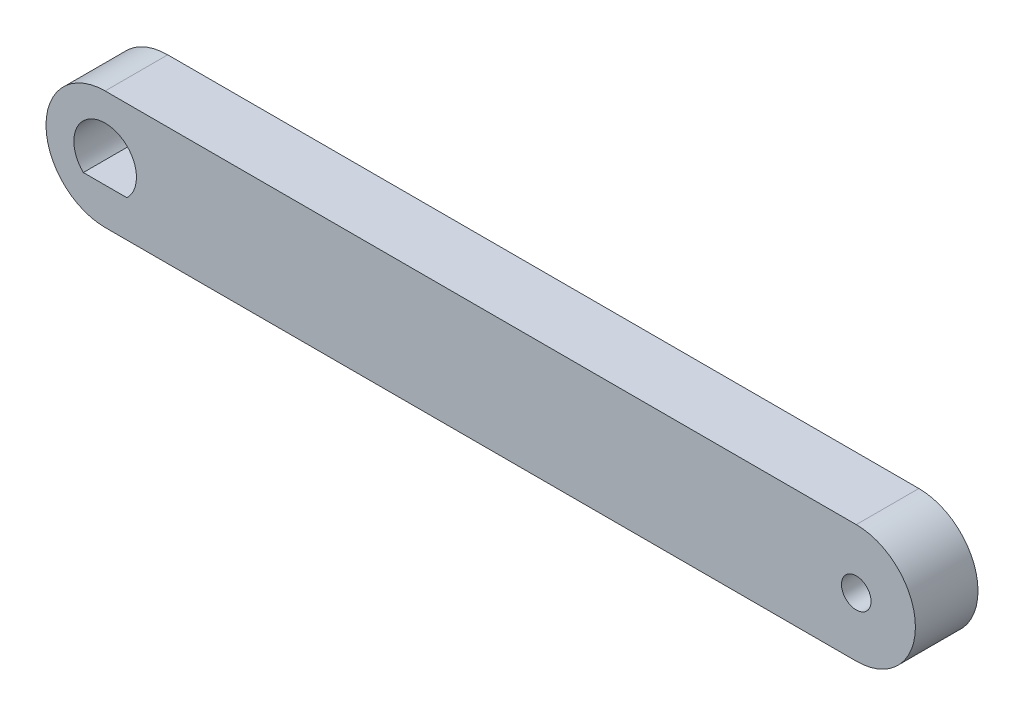
ISO-10303-21;
HEADER;
FILE_DESCRIPTION(('STEP AP214'),'2;1');
FILE_NAME('part.step','',(''),(''),'','','');
FILE_SCHEMA(('AUTOMOTIVE_DESIGN { 1 0 10303 214 1 1 1 1 }'));
ENDSEC;
DATA;
#1=APPLICATION_CONTEXT('core data for automotive mechanical design processes');
#2=APPLICATION_PROTOCOL_DEFINITION('international standard','automotive_design',2000,#1);
#3=PRODUCT_CONTEXT('',#1,'mechanical');
#4=PRODUCT('Part','Part','',(#3));
#5=PRODUCT_RELATED_PRODUCT_CATEGORY('part','',(#4));
#6=PRODUCT_DEFINITION_FORMATION('','',#4);
#7=PRODUCT_DEFINITION_CONTEXT('part definition',#1,'design');
#8=PRODUCT_DEFINITION('design','',#6,#7);
#9=PRODUCT_DEFINITION_SHAPE('','',#8);
#10=(LENGTH_UNIT() NAMED_UNIT(*) SI_UNIT(.MILLI.,.METRE.));
#11=(NAMED_UNIT(*) PLANE_ANGLE_UNIT() SI_UNIT($,.RADIAN.));
#12=(NAMED_UNIT(*) SI_UNIT($,.STERADIAN.) SOLID_ANGLE_UNIT());
#13=UNCERTAINTY_MEASURE_WITH_UNIT(LENGTH_MEASURE(1.E-05),#10,'distance_accuracy_value','');
#14=(GEOMETRIC_REPRESENTATION_CONTEXT(3) GLOBAL_UNCERTAINTY_ASSIGNED_CONTEXT((#13)) GLOBAL_UNIT_ASSIGNED_CONTEXT((#10,
#11,#12)) REPRESENTATION_CONTEXT('',''));
#15=CARTESIAN_POINT('',(0.,0.,0.));
#16=DIRECTION('',(0.,0.,1.));
#17=DIRECTION('',(1.,0.,0.));
#18=AXIS2_PLACEMENT_3D('',#15,#16,#17);
#19=CARTESIAN_POINT('',(0.,0.,6.35));
#20=DIRECTION('',(0.,0.,-1.));
#21=DIRECTION('',(-1.,0.,0.));
#22=AXIS2_PLACEMENT_3D('',#19,#20,#21);
#23=CYLINDRICAL_SURFACE('',#22,6.);
#24=CARTESIAN_POINT('',(0.,0.,0.));
#25=DIRECTION('',(0.,0.,1.));
#26=DIRECTION('',(1.,0.,0.));
#27=AXIS2_PLACEMENT_3D('',#24,#25,#26);
#28=CIRCLE('',#27,6.);
#29=CARTESIAN_POINT('',(0.,6.,0.));
#30=VERTEX_POINT('',#29);
#31=CARTESIAN_POINT('',(0.,-6.,0.));
#32=VERTEX_POINT('',#31);
#33=EDGE_CURVE('E97',#30,#32,#28,.T.);
#34=ORIENTED_EDGE('',*,*,#33,.T.);
#35=DIRECTION('',(0.,0.,-1.));
#36=VECTOR('',#35,1.);
#37=CARTESIAN_POINT('',(0.,-6.,6.35));
#38=LINE('',#37,#36);
#39=CARTESIAN_POINT('',(0.,-6.,6.35));
#40=VERTEX_POINT('',#39);
#41=EDGE_CURVE('E11',#40,#32,#38,.T.);
#42=ORIENTED_EDGE('',*,*,#41,.F.);
#43=CARTESIAN_POINT('',(0.,0.,6.35));
#44=DIRECTION('',(0.,0.,1.));
#45=DIRECTION('',(1.,0.,0.));
#46=AXIS2_PLACEMENT_3D('',#43,#44,#45);
#47=CIRCLE('',#46,6.);
#48=CARTESIAN_POINT('',(0.,6.,6.35));
#49=VERTEX_POINT('',#48);
#50=EDGE_CURVE('E111',#49,#40,#47,.T.);
#51=ORIENTED_EDGE('',*,*,#50,.F.);
#52=DIRECTION('',(0.,0.,-1.));
#53=VECTOR('',#52,1.);
#54=CARTESIAN_POINT('',(0.,6.,6.35));
#55=LINE('',#54,#53);
#56=EDGE_CURVE('E121',#49,#30,#55,.T.);
#57=ORIENTED_EDGE('',*,*,#56,.T.);
#58=EDGE_LOOP('',(#34,#42,#51,#57));
#59=FACE_BOUND('',#58,.T.);
#60=ADVANCED_FACE('F36',(#59),#23,.T.);
#61=CARTESIAN_POINT('',(0.,-6.,6.35));
#62=DIRECTION('',(0.,1.,0.));
#63=DIRECTION('',(0.,0.,1.));
#64=AXIS2_PLACEMENT_3D('',#61,#62,#63);
#65=PLANE('',#64);
#66=DIRECTION('',(1.,0.,0.));
#67=VECTOR('',#66,1.);
#68=CARTESIAN_POINT('',(0.,-6.,0.));
#69=LINE('',#68,#67);
#70=CARTESIAN_POINT('',(76.2,-6.,0.));
#71=VERTEX_POINT('',#70);
#72=EDGE_CURVE('E124',#32,#71,#69,.T.);
#73=ORIENTED_EDGE('',*,*,#72,.T.);
#74=DIRECTION('',(0.,0.,-1.));
#75=VECTOR('',#74,1.);
#76=CARTESIAN_POINT('',(76.2,-6.,6.35));
#77=LINE('',#76,#75);
#78=CARTESIAN_POINT('',(76.2,-6.,6.35));
#79=VERTEX_POINT('',#78);
#80=EDGE_CURVE('E43',#79,#71,#77,.T.);
#81=ORIENTED_EDGE('',*,*,#80,.F.);
#82=DIRECTION('',(1.,0.,0.));
#83=VECTOR('',#82,1.);
#84=CARTESIAN_POINT('',(0.,-6.,6.35));
#85=LINE('',#84,#83);
#86=EDGE_CURVE('E114',#40,#79,#85,.T.);
#87=ORIENTED_EDGE('',*,*,#86,.F.);
#88=ORIENTED_EDGE('',*,*,#41,.T.);
#89=EDGE_LOOP('',(#73,#81,#87,#88));
#90=FACE_BOUND('',#89,.T.);
#91=ADVANCED_FACE('F152',(#90),#65,.F.);
#92=CARTESIAN_POINT('',(76.2,0.,6.35));
#93=DIRECTION('',(0.,0.,-1.));
#94=DIRECTION('',(-1.,0.,0.));
#95=AXIS2_PLACEMENT_3D('',#92,#93,#94);
#96=CYLINDRICAL_SURFACE('',#95,6.);
#97=CARTESIAN_POINT('',(76.2,0.,0.));
#98=DIRECTION('',(0.,0.,1.));
#99=DIRECTION('',(1.,0.,0.));
#100=AXIS2_PLACEMENT_3D('',#97,#98,#99);
#101=CIRCLE('',#100,6.);
#102=CARTESIAN_POINT('',(76.2,6.,0.));
#103=VERTEX_POINT('',#102);
#104=EDGE_CURVE('E126',#71,#103,#101,.T.);
#105=ORIENTED_EDGE('',*,*,#104,.T.);
#106=DIRECTION('',(0.,0.,-1.));
#107=VECTOR('',#106,1.);
#108=CARTESIAN_POINT('',(76.2,6.,6.35));
#109=LINE('',#108,#107);
#110=CARTESIAN_POINT('',(76.2,6.,6.35));
#111=VERTEX_POINT('',#110);
#112=EDGE_CURVE('E131',#111,#103,#109,.T.);
#113=ORIENTED_EDGE('',*,*,#112,.F.);
#114=CARTESIAN_POINT('',(76.2,0.,6.35));
#115=DIRECTION('',(0.,0.,1.));
#116=DIRECTION('',(1.,0.,0.));
#117=AXIS2_PLACEMENT_3D('',#114,#115,#116);
#118=CIRCLE('',#117,6.);
#119=EDGE_CURVE('E117',#79,#111,#118,.T.);
#120=ORIENTED_EDGE('',*,*,#119,.F.);
#121=ORIENTED_EDGE('',*,*,#80,.T.);
#122=EDGE_LOOP('',(#105,#113,#120,#121));
#123=FACE_BOUND('',#122,.T.);
#124=ADVANCED_FACE('F138',(#123),#96,.T.);
#125=CARTESIAN_POINT('',(0.,6.,6.35));
#126=DIRECTION('',(0.,-1.,0.));
#127=DIRECTION('',(0.,0.,-1.));
#128=AXIS2_PLACEMENT_3D('',#125,#126,#127);
#129=PLANE('',#128);
#130=DIRECTION('',(-1.,0.,0.));
#131=VECTOR('',#130,1.);
#132=CARTESIAN_POINT('',(0.,6.,0.));
#133=LINE('',#132,#131);
#134=EDGE_CURVE('E115',#103,#30,#133,.T.);
#135=ORIENTED_EDGE('',*,*,#134,.T.);
#136=ORIENTED_EDGE('',*,*,#56,.F.);
#137=DIRECTION('',(-1.,0.,0.));
#138=VECTOR('',#137,1.);
#139=CARTESIAN_POINT('',(0.,6.,6.35));
#140=LINE('',#139,#138);
#141=EDGE_CURVE('E119',#111,#49,#140,.T.);
#142=ORIENTED_EDGE('',*,*,#141,.F.);
#143=ORIENTED_EDGE('',*,*,#112,.T.);
#144=EDGE_LOOP('',(#135,#136,#142,#143));
#145=FACE_BOUND('',#144,.T.);
#146=ADVANCED_FACE('F145',(#145),#129,.F.);
#147=CARTESIAN_POINT('',(0.,0.,6.35));
#148=DIRECTION('',(0.,0.,1.));
#149=DIRECTION('',(1.,0.,0.));
#150=AXIS2_PLACEMENT_3D('',#147,#148,#149);
#151=PLANE('',#150);
#152=CARTESIAN_POINT('',(76.2,0.,6.35));
#153=DIRECTION('',(0.,0.,1.));
#154=DIRECTION('',(1.,0.,0.));
#155=AXIS2_PLACEMENT_3D('',#152,#153,#154);
#156=CIRCLE('',#155,1.5);
#157=CARTESIAN_POINT('',(77.7,0.,6.35));
#158=VERTEX_POINT('',#157);
#159=EDGE_CURVE('E105',#158,#158,#156,.T.);
#160=ORIENTED_EDGE('',*,*,#159,.F.);
#161=EDGE_LOOP('',(#160));
#162=FACE_BOUND('',#161,.T.);
#163=CARTESIAN_POINT('',(0.,0.,6.35));
#164=DIRECTION('',(0.,0.,1.));
#165=DIRECTION('',(1.,0.,0.));
#166=AXIS2_PLACEMENT_3D('',#163,#164,#165);
#167=CIRCLE('',#166,3.175);
#168=CARTESIAN_POINT('',(2.21472345903501,-2.275,6.35));
#169=VERTEX_POINT('',#168);
#170=CARTESIAN_POINT('',(-2.21472345903501,-2.275,6.35));
#171=VERTEX_POINT('',#170);
#172=EDGE_CURVE('E50',#169,#171,#167,.T.);
#173=ORIENTED_EDGE('',*,*,#172,.F.);
#174=DIRECTION('',(1.,0.,0.));
#175=VECTOR('',#174,1.);
#176=CARTESIAN_POINT('',(-2.21472345903501,-2.275,6.35));
#177=LINE('',#176,#175);
#178=EDGE_CURVE('E91',#171,#169,#177,.T.);
#179=ORIENTED_EDGE('',*,*,#178,.F.);
#180=EDGE_LOOP('',(#173,#179));
#181=FACE_BOUND('',#180,.T.);
#182=ORIENTED_EDGE('',*,*,#50,.T.);
#183=ORIENTED_EDGE('',*,*,#86,.T.);
#184=ORIENTED_EDGE('',*,*,#119,.T.);
#185=ORIENTED_EDGE('',*,*,#141,.T.);
#186=EDGE_LOOP('',(#182,#183,#184,#185));
#187=FACE_BOUND('',#186,.T.);
#188=ADVANCED_FACE('F151',(#162,#181,#187),#151,.T.);
#189=CARTESIAN_POINT('',(0.,0.,0.));
#190=DIRECTION('',(0.,0.,1.));
#191=DIRECTION('',(1.,0.,0.));
#192=AXIS2_PLACEMENT_3D('',#189,#190,#191);
#193=PLANE('',#192);
#194=CARTESIAN_POINT('',(76.2,0.,0.));
#195=DIRECTION('',(0.,0.,1.));
#196=DIRECTION('',(1.,0.,0.));
#197=AXIS2_PLACEMENT_3D('',#194,#195,#196);
#198=CIRCLE('',#197,1.5);
#199=CARTESIAN_POINT('',(77.7,0.,0.));
#200=VERTEX_POINT('',#199);
#201=EDGE_CURVE('E101',#200,#200,#198,.T.);
#202=ORIENTED_EDGE('',*,*,#201,.T.);
#203=EDGE_LOOP('',(#202));
#204=FACE_BOUND('',#203,.T.);
#205=DIRECTION('',(-1.,0.,0.));
#206=VECTOR('',#205,1.);
#207=CARTESIAN_POINT('',(-2.21472345903501,-2.275,0.));
#208=LINE('',#207,#206);
#209=CARTESIAN_POINT('',(2.21472345903501,-2.275,0.));
#210=VERTEX_POINT('',#209);
#211=CARTESIAN_POINT('',(-2.21472345903501,-2.275,0.));
#212=VERTEX_POINT('',#211);
#213=EDGE_CURVE('E94',#210,#212,#208,.T.);
#214=ORIENTED_EDGE('',*,*,#213,.F.);
#215=CARTESIAN_POINT('',(0.,0.,0.));
#216=DIRECTION('',(0.,0.,1.));
#217=DIRECTION('',(1.,0.,0.));
#218=AXIS2_PLACEMENT_3D('',#215,#216,#217);
#219=CIRCLE('',#218,3.175);
#220=EDGE_CURVE('E55',#212,#210,#219,.F.);
#221=ORIENTED_EDGE('',*,*,#220,.F.);
#222=EDGE_LOOP('',(#214,#221));
#223=FACE_BOUND('',#222,.T.);
#224=ORIENTED_EDGE('',*,*,#33,.F.);
#225=ORIENTED_EDGE('',*,*,#134,.F.);
#226=ORIENTED_EDGE('',*,*,#104,.F.);
#227=ORIENTED_EDGE('',*,*,#72,.F.);
#228=EDGE_LOOP('',(#224,#225,#226,#227));
#229=FACE_BOUND('',#228,.T.);
#230=ADVANCED_FACE('F99',(#204,#223,#229),#193,.F.);
#231=CARTESIAN_POINT('',(0.,0.,-0.00100000000000013));
#232=DIRECTION('',(0.,0.,1.));
#233=DIRECTION('',(1.,0.,0.));
#234=AXIS2_PLACEMENT_3D('',#231,#232,#233);
#235=CYLINDRICAL_SURFACE('',#234,3.175);
#236=ORIENTED_EDGE('',*,*,#220,.T.);
#237=DIRECTION('',(0.,0.,1.));
#238=VECTOR('',#237,1.);
#239=CARTESIAN_POINT('',(2.21472345903501,-2.275,-0.00100000000000013));
#240=LINE('',#239,#238);
#241=EDGE_CURVE('E90',#210,#169,#240,.T.);
#242=ORIENTED_EDGE('',*,*,#241,.T.);
#243=ORIENTED_EDGE('',*,*,#172,.T.);
#244=DIRECTION('',(0.,0.,1.));
#245=VECTOR('',#244,1.);
#246=CARTESIAN_POINT('',(-2.21472345903501,-2.275,-0.00100000000000013));
#247=LINE('',#246,#245);
#248=EDGE_CURVE('E84',#212,#171,#247,.T.);
#249=ORIENTED_EDGE('',*,*,#248,.F.);
#250=EDGE_LOOP('',(#236,#242,#243,#249));
#251=FACE_BOUND('',#250,.T.);
#252=ADVANCED_FACE('F86',(#251),#235,.F.);
#253=CARTESIAN_POINT('',(-2.21472345903501,-2.275,-0.00100000000000013));
#254=DIRECTION('',(0.,-1.,0.));
#255=DIRECTION('',(0.,0.,-1.));
#256=AXIS2_PLACEMENT_3D('',#253,#254,#255);
#257=PLANE('',#256);
#258=ORIENTED_EDGE('',*,*,#213,.T.);
#259=ORIENTED_EDGE('',*,*,#248,.T.);
#260=ORIENTED_EDGE('',*,*,#178,.T.);
#261=ORIENTED_EDGE('',*,*,#241,.F.);
#262=EDGE_LOOP('',(#258,#259,#260,#261));
#263=FACE_BOUND('',#262,.T.);
#264=ADVANCED_FACE('F95',(#263),#257,.F.);
#265=CARTESIAN_POINT('',(76.2,0.,0.));
#266=DIRECTION('',(0.,0.,1.));
#267=DIRECTION('',(1.,0.,0.));
#268=AXIS2_PLACEMENT_3D('',#265,#266,#267);
#269=CYLINDRICAL_SURFACE('',#268,1.5);
#270=ORIENTED_EDGE('',*,*,#201,.F.);
#271=EDGE_LOOP('',(#270));
#272=FACE_BOUND('',#271,.T.);
#273=ORIENTED_EDGE('',*,*,#159,.T.);
#274=EDGE_LOOP('',(#273));
#275=FACE_BOUND('',#274,.T.);
#276=ADVANCED_FACE('F172',(#272,#275),#269,.F.);
#277=CLOSED_SHELL('',(#60,#91,#124,#146,#188,#230,#252,#264,#276));
#278=MANIFOLD_SOLID_BREP('B2',#277);
#279=ADVANCED_BREP_SHAPE_REPRESENTATION('',(#18,#278),#14);
#280=SHAPE_DEFINITION_REPRESENTATION(#9,#279);
ENDSEC;
END-ISO-10303-21;
